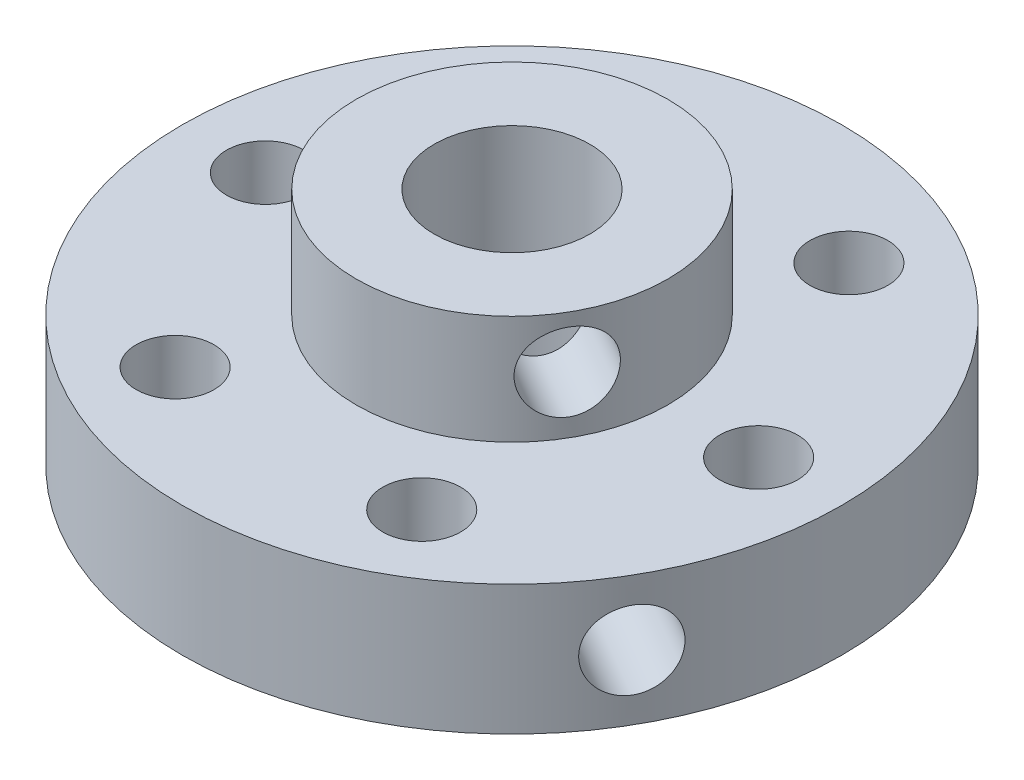
ISO-10303-21;
HEADER;
FILE_DESCRIPTION(('STEP AP214'),'2;1');
FILE_NAME('part.step','',(''),(''),'','','');
FILE_SCHEMA(('AUTOMOTIVE_DESIGN { 1 0 10303 214 1 1 1 1 }'));
ENDSEC;
DATA;
#1=APPLICATION_CONTEXT('core data for automotive mechanical design processes');
#2=APPLICATION_PROTOCOL_DEFINITION('international standard','automotive_design',2000,#1);
#3=PRODUCT_CONTEXT('',#1,'mechanical');
#4=PRODUCT('Part','Part','',(#3));
#5=PRODUCT_RELATED_PRODUCT_CATEGORY('part','',(#4));
#6=PRODUCT_DEFINITION_FORMATION('','',#4);
#7=PRODUCT_DEFINITION_CONTEXT('part definition',#1,'design');
#8=PRODUCT_DEFINITION('design','',#6,#7);
#9=PRODUCT_DEFINITION_SHAPE('','',#8);
#10=(LENGTH_UNIT() NAMED_UNIT(*) SI_UNIT(.MILLI.,.METRE.));
#11=(NAMED_UNIT(*) PLANE_ANGLE_UNIT() SI_UNIT($,.RADIAN.));
#12=(NAMED_UNIT(*) SI_UNIT($,.STERADIAN.) SOLID_ANGLE_UNIT());
#13=UNCERTAINTY_MEASURE_WITH_UNIT(LENGTH_MEASURE(1.E-05),#10,'distance_accuracy_value','');
#14=(GEOMETRIC_REPRESENTATION_CONTEXT(3) GLOBAL_UNCERTAINTY_ASSIGNED_CONTEXT((#13)) GLOBAL_UNIT_ASSIGNED_CONTEXT((#10,
#11,#12)) REPRESENTATION_CONTEXT('',''));
#15=CARTESIAN_POINT('',(0.,0.,0.));
#16=DIRECTION('',(0.,0.,1.));
#17=DIRECTION('',(1.,0.,0.));
#18=AXIS2_PLACEMENT_3D('',#15,#16,#17);
#19=CARTESIAN_POINT('',(0.,5.,0.));
#20=DIRECTION('',(0.,1.,0.));
#21=DIRECTION('',(0.,0.,1.));
#22=AXIS2_PLACEMENT_3D('',#19,#20,#21);
#23=PLANE('',#22);
#24=CARTESIAN_POINT('',(-4.7500000000001,5.,8.22724133595211));
#25=DIRECTION('',(0.,1.,0.));
#26=DIRECTION('',(0.,0.,1.));
#27=AXIS2_PLACEMENT_3D('',#24,#25,#26);
#28=CIRCLE('',#27,1.5);
#29=CARTESIAN_POINT('',(-4.7500000000001,5.,9.72724133595211));
#30=VERTEX_POINT('',#29);
#31=EDGE_CURVE('E77',#30,#30,#28,.T.);
#32=ORIENTED_EDGE('',*,*,#31,.F.);
#33=EDGE_LOOP('',(#32));
#34=FACE_BOUND('',#33,.T.);
#35=CARTESIAN_POINT('',(4.74999999999992,5.,8.22724133595221));
#36=DIRECTION('',(0.,1.,0.));
#37=DIRECTION('',(0.,0.,1.));
#38=AXIS2_PLACEMENT_3D('',#35,#36,#37);
#39=CIRCLE('',#38,1.5);
#40=CARTESIAN_POINT('',(4.74999999999992,5.,9.72724133595221));
#41=VERTEX_POINT('',#40);
#42=EDGE_CURVE('E73',#41,#41,#39,.T.);
#43=ORIENTED_EDGE('',*,*,#42,.F.);
#44=EDGE_LOOP('',(#43));
#45=FACE_BOUND('',#44,.T.);
#46=CARTESIAN_POINT('',(9.5,5.,0.));
#47=DIRECTION('',(0.,1.,0.));
#48=DIRECTION('',(0.,0.,1.));
#49=AXIS2_PLACEMENT_3D('',#46,#47,#48);
#50=CIRCLE('',#49,1.5);
#51=CARTESIAN_POINT('',(9.5,5.,1.50000000000007));
#52=VERTEX_POINT('',#51);
#53=EDGE_CURVE('E69',#52,#52,#50,.T.);
#54=ORIENTED_EDGE('',*,*,#53,.F.);
#55=EDGE_LOOP('',(#54));
#56=FACE_BOUND('',#55,.T.);
#57=CARTESIAN_POINT('',(4.75000000000004,5.,-8.22724133595215));
#58=DIRECTION('',(0.,1.,0.));
#59=DIRECTION('',(0.,0.,1.));
#60=AXIS2_PLACEMENT_3D('',#57,#58,#59);
#61=CIRCLE('',#60,1.5);
#62=CARTESIAN_POINT('',(4.75000000000004,5.,-6.72724133595215));
#63=VERTEX_POINT('',#62);
#64=EDGE_CURVE('E65',#63,#63,#61,.T.);
#65=ORIENTED_EDGE('',*,*,#64,.F.);
#66=EDGE_LOOP('',(#65));
#67=FACE_BOUND('',#66,.T.);
#68=CARTESIAN_POINT('',(-4.74999999999998,5.,-8.22724133595218));
#69=DIRECTION('',(0.,1.,0.));
#70=DIRECTION('',(0.,0.,1.));
#71=AXIS2_PLACEMENT_3D('',#68,#69,#70);
#72=CIRCLE('',#71,1.5);
#73=CARTESIAN_POINT('',(-4.74999999999998,5.,-6.72724133595218));
#74=VERTEX_POINT('',#73);
#75=EDGE_CURVE('E61',#74,#74,#72,.T.);
#76=ORIENTED_EDGE('',*,*,#75,.F.);
#77=EDGE_LOOP('',(#76));
#78=FACE_BOUND('',#77,.T.);
#79=CARTESIAN_POINT('',(-9.5,5.,0.));
#80=DIRECTION('',(0.,1.,0.));
#81=DIRECTION('',(0.,0.,1.));
#82=AXIS2_PLACEMENT_3D('',#79,#80,#81);
#83=CIRCLE('',#82,1.5);
#84=CARTESIAN_POINT('',(-9.5,5.,1.5));
#85=VERTEX_POINT('',#84);
#86=EDGE_CURVE('E60',#85,#85,#83,.T.);
#87=ORIENTED_EDGE('',*,*,#86,.F.);
#88=EDGE_LOOP('',(#87));
#89=FACE_BOUND('',#88,.T.);
#90=CARTESIAN_POINT('',(0.,5.,0.));
#91=DIRECTION('',(0.,1.,0.));
#92=DIRECTION('',(0.,0.,1.));
#93=AXIS2_PLACEMENT_3D('',#90,#91,#92);
#94=CIRCLE('',#93,12.7);
#95=CARTESIAN_POINT('',(0.,5.,12.7));
#96=VERTEX_POINT('',#95);
#97=EDGE_CURVE('E10',#96,#96,#94,.T.);
#98=ORIENTED_EDGE('',*,*,#97,.T.);
#99=EDGE_LOOP('',(#98));
#100=FACE_BOUND('',#99,.T.);
#101=CARTESIAN_POINT('',(0.,5.,0.));
#102=DIRECTION('',(0.,1.,0.));
#103=DIRECTION('',(0.,0.,1.));
#104=AXIS2_PLACEMENT_3D('',#101,#102,#103);
#105=CIRCLE('',#104,6.);
#106=CARTESIAN_POINT('',(0.,5.,6.));
#107=VERTEX_POINT('',#106);
#108=EDGE_CURVE('E54',#107,#107,#105,.T.);
#109=ORIENTED_EDGE('',*,*,#108,.F.);
#110=EDGE_LOOP('',(#109));
#111=FACE_BOUND('',#110,.T.);
#112=ADVANCED_FACE('F33',(#34,#45,#56,#67,#78,#89,#100,#111),#23,.T.);
#113=CARTESIAN_POINT('',(0.,5.,0.));
#114=DIRECTION('',(0.,-1.,0.));
#115=DIRECTION('',(0.,0.,-1.));
#116=AXIS2_PLACEMENT_3D('',#113,#114,#115);
#117=CYLINDRICAL_SURFACE('',#116,12.7);
#118=CARTESIAN_POINT('',(11.6715383531808,2.5,5.00651500249722));
#119=CARTESIAN_POINT('',(11.6715375511328,2.41606022007603,5.0065186850722));
#120=CARTESIAN_POINT('',(11.6687371402096,2.33206707141792,5.01306104844977));
#121=CARTESIAN_POINT('',(11.6575487227989,2.16641569284176,5.03902271017339));
#122=CARTESIAN_POINT('',(11.6491547825431,2.08476003864453,5.05845568312929));
#123=CARTESIAN_POINT('',(11.6268491033756,1.92620614824594,5.10951575215548));
#124=CARTESIAN_POINT('',(11.6129409901787,1.84930482427662,5.14113483515477));
#125=CARTESIAN_POINT('',(11.5797351416414,1.70237121936865,5.21549462853855));
#126=CARTESIAN_POINT('',(11.5604383718177,1.63233771091851,5.2582333464604));
#127=CARTESIAN_POINT('',(11.5165602597939,1.50076168387389,5.35365310882416));
#128=CARTESIAN_POINT('',(11.4919556690369,1.43925854089039,5.40637776410837));
#129=CARTESIAN_POINT('',(11.4378314457157,1.32682892417707,5.51996027188924));
#130=CARTESIAN_POINT('',(11.4083115747294,1.2759029637766,5.58081851888802));
#131=CARTESIAN_POINT('',(11.3447314286383,1.18593337302553,5.7089571247974));
#132=CARTESIAN_POINT('',(11.3106580376303,1.14692517904565,5.776255869613));
#133=CARTESIAN_POINT('',(11.23869753301,1.0821253045689,5.91504702402329));
#134=CARTESIAN_POINT('',(11.2008105464809,1.05633318383801,5.98653929384114));
#135=CARTESIAN_POINT('',(11.1222746857511,1.01881469808402,6.13121074051527));
#136=CARTESIAN_POINT('',(11.0816395710108,1.00702305244594,6.20438045376266));
#137=CARTESIAN_POINT('',(10.998512641152,0.997638020019918,6.35057387860671));
#138=CARTESIAN_POINT('',(10.9560208917337,1.00004413122345,6.42359759527423));
#139=CARTESIAN_POINT('',(10.870634808896,1.01893379601258,6.56705677899792));
#140=CARTESIAN_POINT('',(10.8277435363973,1.03534714601565,6.6375033295666));
#141=CARTESIAN_POINT('',(10.742699868983,1.08167574223186,6.77428146203633));
#142=CARTESIAN_POINT('',(10.7005474868392,1.11159122159295,6.84061297285846));
#143=CARTESIAN_POINT('',(10.618299567646,1.18415022962009,6.96760053693703));
#144=CARTESIAN_POINT('',(10.5782092474188,1.22682434264288,7.02824248729147));
#145=CARTESIAN_POINT('',(10.5016227204509,1.3236670220063,7.1421733220564));
#146=CARTESIAN_POINT('',(10.4651266610014,1.3778360591171,7.19546190516502));
#147=CARTESIAN_POINT('',(10.3968869927955,1.49652461569217,7.29371980185864));
#148=CARTESIAN_POINT('',(10.365173747301,1.56110528597974,7.33863635863888));
#149=CARTESIAN_POINT('',(10.3080277339784,1.69857325819117,7.4186920079933));
#150=CARTESIAN_POINT('',(10.2825949822286,1.77146058137982,7.45383107553661));
#151=CARTESIAN_POINT('',(10.2390580508462,1.92352487103104,7.51352529742341));
#152=CARTESIAN_POINT('',(10.2209564664634,2.00270405298137,7.5380767039098));
#153=CARTESIAN_POINT('',(10.1928781268933,2.16507778504808,7.57600140912822));
#154=CARTESIAN_POINT('',(10.1829010234175,2.24827216287493,7.58937518703497));
#155=CARTESIAN_POINT('',(10.1715480396365,2.415778062783,7.60458424832536));
#156=CARTESIAN_POINT('',(10.1701207007547,2.50007983446653,7.60648856349156));
#157=CARTESIAN_POINT('',(10.1757929703964,2.6678780433266,7.59889853780723));
#158=CARTESIAN_POINT('',(10.1828924170989,2.75137449575614,7.58940441327586));
#159=CARTESIAN_POINT('',(10.2052705811091,2.91493773669146,7.55928561547891));
#160=CARTESIAN_POINT('',(10.2205248015315,2.99501402536882,7.53869427667575));
#161=CARTESIAN_POINT('',(10.2585424280401,3.14976050360252,7.48687744007665));
#162=CARTESIAN_POINT('',(10.2813060710194,3.2244305225214,7.45565160680267));
#163=CARTESIAN_POINT('',(10.3335236416589,3.36663259994591,7.38310831074652));
#164=CARTESIAN_POINT('',(10.3630086781427,3.43412925794285,7.34174385391931));
#165=CARTESIAN_POINT('',(10.4274284480773,3.55970808983753,7.24995666743039));
#166=CARTESIAN_POINT('',(10.4623633703968,3.61778993731794,7.19953362382958));
#167=CARTESIAN_POINT('',(10.5365361163634,3.72318917396867,7.0905405667121));
#168=CARTESIAN_POINT('',(10.5757948583392,3.77045049257152,7.03193054298297));
#169=CARTESIAN_POINT('',(10.6570237365906,3.85247976246808,6.90820627547804));
#170=CARTESIAN_POINT('',(10.6989938232688,3.88724794221714,6.84309215066709));
#171=CARTESIAN_POINT('',(10.784075510516,3.9432106803739,6.70820786311629));
#172=CARTESIAN_POINT('',(10.8271840834794,3.9644380761281,6.63844942083571));
#173=CARTESIAN_POINT('',(10.9132291756426,3.99282361152357,6.49602549532545));
#174=CARTESIAN_POINT('',(10.9561657016596,3.99998231423368,6.42336012855788));
#175=CARTESIAN_POINT('',(11.0403113313993,4.00001751368946,6.27762402175686));
#176=CARTESIAN_POINT('',(11.0815293555714,3.99298063969374,6.20455843784483));
#177=CARTESIAN_POINT('',(11.1614017298833,3.96500737290691,6.05969925383828));
#178=CARTESIAN_POINT('',(11.2000560805332,3.94407098288102,5.9879056534907));
#179=CARTESIAN_POINT('',(11.2738748561457,3.88891927496915,5.84773662949455));
#180=CARTESIAN_POINT('',(11.3090402452249,3.8547076383819,5.77936026415637));
#181=CARTESIAN_POINT('',(11.3751835780473,3.77398556803596,5.64806243472268));
#182=CARTESIAN_POINT('',(11.4061614937783,3.72747505200944,5.58514100711928));
#183=CARTESIAN_POINT('',(11.4635773185857,3.62315345534259,5.46633160477655));
#184=CARTESIAN_POINT('',(11.489987605967,3.56527785258845,5.4104869330501));
#185=CARTESIAN_POINT('',(11.5376823041713,3.44000171739053,5.30802128938899));
#186=CARTESIAN_POINT('',(11.5589654952199,3.37259892439749,5.26140251283327));
#187=CARTESIAN_POINT('',(11.5962187015426,3.22991717495939,5.17878162753473));
#188=CARTESIAN_POINT('',(11.6121700913129,3.1546117913843,5.14281678476389));
#189=CARTESIAN_POINT('',(11.6384914873378,2.99849487376943,5.08297101821705));
#190=CARTESIAN_POINT('',(11.6488676318486,2.91768950605936,5.05907680661026));
#191=CARTESIAN_POINT('',(11.6614547174806,2.7803781096023,5.02997275348386));
#192=CARTESIAN_POINT('',(11.6652341186577,2.72474194804356,5.02119051680439));
#193=CARTESIAN_POINT('',(11.6702761977197,2.61274521482581,5.00946042340066));
#194=CARTESIAN_POINT('',(11.6715388919384,2.55638464787067,5.0065125288108));
#195=CARTESIAN_POINT('',(11.6715383531808,2.5,5.00651500249722));
#196=B_SPLINE_CURVE_WITH_KNOTS('',3,(#118,#119,#120,#121,#122,#123,#124,#125,#126,#127,#128,
#129,#130,#131,#132,#133,#134,#135,#136,#137,#138,#139,#140,#141,#142,#143,#144,#145,#146,#147,
#148,#149,#150,#151,#152,#153,#154,#155,#156,#157,#158,#159,#160,#161,#162,#163,#164,#165,#166,
#167,#168,#169,#170,#171,#172,#173,#174,#175,#176,#177,#178,#179,#180,#181,#182,#183,#184,#185,
#186,#187,#188,#189,#190,#191,#192,#193,#194,#195),.UNSPECIFIED.,.T.,.F.,(4,2,2,2,2,2,2,2,2,2,2,
2,2,2,2,2,2,2,2,2,2,2,2,2,2,2,2,2,2,2,2,2,2,2,2,2,2,2,4),(0.,0.251613380748291,
0.503494105646092,0.75520948623113,1.00687979442843,1.25967566386849,1.51248379907322,
1.76603647969037,2.0195807137912,2.27193803464322,2.52428643262321,2.77537745114223,
3.02647280554001,3.27817496610754,3.5298874370301,3.78313609467784,4.0363854006491,
4.28972427925203,4.54305229689169,4.79485406155235,5.04665104760417,5.29769585292151,
5.54874857848584,5.80098773913409,6.05323564320078,6.3067624835944,6.56028468764223,
6.8131897215963,7.06608463337016,7.31744090938854,7.568797135401,7.82008370870756,
8.07137196292548,8.32413038231695,8.57694887555923,8.83064152451594,9.08405428658975,
9.25307097883103,9.42208657412913),.UNSPECIFIED.);
#197=CARTESIAN_POINT('',(11.6715383531808,2.5,5.00651500249722));
#198=VERTEX_POINT('',#197);
#199=EDGE_CURVE('E80',#198,#198,#196,.T.);
#200=ORIENTED_EDGE('',*,*,#199,.T.);
#201=EDGE_LOOP('',(#200));
#202=FACE_BOUND('',#201,.T.);
#203=ORIENTED_EDGE('',*,*,#97,.F.);
#204=EDGE_LOOP('',(#203));
#205=FACE_BOUND('',#204,.T.);
#206=CARTESIAN_POINT('',(0.,0.,0.));
#207=DIRECTION('',(0.,1.,0.));
#208=DIRECTION('',(0.,0.,1.));
#209=AXIS2_PLACEMENT_3D('',#206,#207,#208);
#210=CIRCLE('',#209,12.7);
#211=CARTESIAN_POINT('',(0.,0.,12.7));
#212=VERTEX_POINT('',#211);
#213=EDGE_CURVE('E46',#212,#212,#210,.T.);
#214=ORIENTED_EDGE('',*,*,#213,.T.);
#215=EDGE_LOOP('',(#214));
#216=FACE_BOUND('',#215,.T.);
#217=ADVANCED_FACE('F35',(#202,#205,#216),#117,.T.);
#218=CARTESIAN_POINT('',(0.,0.,0.));
#219=DIRECTION('',(0.,1.,0.));
#220=DIRECTION('',(0.,0.,1.));
#221=AXIS2_PLACEMENT_3D('',#218,#219,#220);
#222=PLANE('',#221);
#223=CARTESIAN_POINT('',(-4.7500000000001,0.,8.22724133595211));
#224=DIRECTION('',(0.,1.,0.));
#225=DIRECTION('',(0.,0.,1.));
#226=AXIS2_PLACEMENT_3D('',#223,#224,#225);
#227=CIRCLE('',#226,1.5);
#228=CARTESIAN_POINT('',(-4.7500000000001,0.,9.72724133595211));
#229=VERTEX_POINT('',#228);
#230=EDGE_CURVE('E78',#229,#229,#227,.T.);
#231=ORIENTED_EDGE('',*,*,#230,.T.);
#232=EDGE_LOOP('',(#231));
#233=FACE_BOUND('',#232,.T.);
#234=CARTESIAN_POINT('',(4.74999999999992,0.,8.22724133595221));
#235=DIRECTION('',(0.,1.,0.));
#236=DIRECTION('',(0.,0.,1.));
#237=AXIS2_PLACEMENT_3D('',#234,#235,#236);
#238=CIRCLE('',#237,1.5);
#239=CARTESIAN_POINT('',(4.74999999999992,0.,9.72724133595221));
#240=VERTEX_POINT('',#239);
#241=EDGE_CURVE('E74',#240,#240,#238,.T.);
#242=ORIENTED_EDGE('',*,*,#241,.T.);
#243=EDGE_LOOP('',(#242));
#244=FACE_BOUND('',#243,.T.);
#245=CARTESIAN_POINT('',(9.5,0.,0.));
#246=DIRECTION('',(0.,1.,0.));
#247=DIRECTION('',(0.,0.,1.));
#248=AXIS2_PLACEMENT_3D('',#245,#246,#247);
#249=CIRCLE('',#248,1.5);
#250=CARTESIAN_POINT('',(9.5,0.,1.50000000000007));
#251=VERTEX_POINT('',#250);
#252=EDGE_CURVE('E70',#251,#251,#249,.T.);
#253=ORIENTED_EDGE('',*,*,#252,.T.);
#254=EDGE_LOOP('',(#253));
#255=FACE_BOUND('',#254,.T.);
#256=CARTESIAN_POINT('',(4.75000000000004,0.,-8.22724133595215));
#257=DIRECTION('',(0.,1.,0.));
#258=DIRECTION('',(0.,0.,1.));
#259=AXIS2_PLACEMENT_3D('',#256,#257,#258);
#260=CIRCLE('',#259,1.5);
#261=CARTESIAN_POINT('',(4.75000000000004,0.,-6.72724133595215));
#262=VERTEX_POINT('',#261);
#263=EDGE_CURVE('E66',#262,#262,#260,.T.);
#264=ORIENTED_EDGE('',*,*,#263,.T.);
#265=EDGE_LOOP('',(#264));
#266=FACE_BOUND('',#265,.T.);
#267=CARTESIAN_POINT('',(-4.74999999999998,0.,-8.22724133595218));
#268=DIRECTION('',(0.,1.,0.));
#269=DIRECTION('',(0.,0.,1.));
#270=AXIS2_PLACEMENT_3D('',#267,#268,#269);
#271=CIRCLE('',#270,1.5);
#272=CARTESIAN_POINT('',(-4.74999999999998,0.,-6.72724133595218));
#273=VERTEX_POINT('',#272);
#274=EDGE_CURVE('E62',#273,#273,#271,.T.);
#275=ORIENTED_EDGE('',*,*,#274,.T.);
#276=EDGE_LOOP('',(#275));
#277=FACE_BOUND('',#276,.T.);
#278=CARTESIAN_POINT('',(-9.5,0.,0.));
#279=DIRECTION('',(0.,1.,0.));
#280=DIRECTION('',(0.,0.,1.));
#281=AXIS2_PLACEMENT_3D('',#278,#279,#280);
#282=CIRCLE('',#281,1.5);
#283=CARTESIAN_POINT('',(-9.5,0.,1.5));
#284=VERTEX_POINT('',#283);
#285=EDGE_CURVE('E57',#284,#284,#282,.T.);
#286=ORIENTED_EDGE('',*,*,#285,.T.);
#287=EDGE_LOOP('',(#286));
#288=FACE_BOUND('',#287,.T.);
#289=CARTESIAN_POINT('',(0.,0.,0.));
#290=DIRECTION('',(0.,1.,0.));
#291=DIRECTION('',(0.,0.,1.));
#292=AXIS2_PLACEMENT_3D('',#289,#290,#291);
#293=CIRCLE('',#292,3.);
#294=CARTESIAN_POINT('',(0.,0.,3.));
#295=VERTEX_POINT('',#294);
#296=EDGE_CURVE('E125',#295,#295,#293,.T.);
#297=ORIENTED_EDGE('',*,*,#296,.T.);
#298=EDGE_LOOP('',(#297));
#299=FACE_BOUND('',#298,.T.);
#300=ORIENTED_EDGE('',*,*,#213,.F.);
#301=EDGE_LOOP('',(#300));
#302=FACE_BOUND('',#301,.T.);
#303=ADVANCED_FACE('F141',(#233,#244,#255,#266,#277,#288,#299,#302),#222,.F.);
#304=CARTESIAN_POINT('',(0.,9.2,0.));
#305=DIRECTION('',(0.,-1.,0.));
#306=DIRECTION('',(0.,0.,-1.));
#307=AXIS2_PLACEMENT_3D('',#304,#305,#306);
#308=CYLINDRICAL_SURFACE('',#307,6.);
#309=CARTESIAN_POINT('',(5.78115294937452,7.2,1.60569940397895));
#310=CARTESIAN_POINT('',(5.78115314231204,7.11716954944523,1.6057022322028));
#311=CARTESIAN_POINT('',(5.77926171584209,7.0343130607932,1.6125567500908));
#312=CARTESIAN_POINT('',(5.77162561713858,6.87097945309558,1.63967353276891));
#313=CARTESIAN_POINT('',(5.76587870231826,6.790503747319,1.65994360076726));
#314=CARTESIAN_POINT('',(5.75034604035946,6.63431787708778,1.71297319214652));
#315=CARTESIAN_POINT('',(5.74056550597316,6.5586017067686,1.74571659176208));
#316=CARTESIAN_POINT('',(5.7166878648689,6.41381348847605,1.82238447138034));
#317=CARTESIAN_POINT('',(5.70259057488481,6.34474172275186,1.86630942607815));
#318=CARTESIAN_POINT('',(5.66944577568131,6.21368301284268,1.96472046203058));
#319=CARTESIAN_POINT('',(5.65030559429271,6.15186383978997,2.01939880387075));
#320=CARTESIAN_POINT('',(5.60694261692958,6.0385431633838,2.13684501853835));
#321=CARTESIAN_POINT('',(5.58271934621553,5.98704262462695,2.19961364675369));
#322=CARTESIAN_POINT('',(5.52869561458064,5.89513471942123,2.33210328221008));
#323=CARTESIAN_POINT('',(5.49882204924164,5.85489216710312,2.40190907774058));
#324=CARTESIAN_POINT('',(5.43388533273655,5.78771421350815,2.5454042643088));
#325=CARTESIAN_POINT('',(5.39882294825177,5.76077684885069,2.61909308057128));
#326=CARTESIAN_POINT('',(5.32480824085292,5.72151129925285,2.76641869245945));
#327=CARTESIAN_POINT('',(5.28594911057378,5.70889821340405,2.84002630039448));
#328=CARTESIAN_POINT('',(5.20468739773283,5.69774497243467,2.98634011890088));
#329=CARTESIAN_POINT('',(5.1622853399787,5.69920273667424,3.05904646114937));
#330=CARTESIAN_POINT('',(5.07619887781652,5.71594491015009,3.19982277374007));
#331=CARTESIAN_POINT('',(5.03256380576343,5.73092179503231,3.26795982417603));
#332=CARTESIAN_POINT('',(4.94461266506464,5.7737827620291,3.39956967865773));
#333=CARTESIAN_POINT('',(4.90029656028919,5.80166753122645,3.4630422342054));
#334=CARTESIAN_POINT('',(4.81221827235016,5.86980154241224,3.58444357158893));
#335=CARTESIAN_POINT('',(4.76846471209192,5.91016022679705,3.64231708089813));
#336=CARTESIAN_POINT('',(4.68365710698843,6.00201340746975,3.75074677118076));
#337=CARTESIAN_POINT('',(4.64260353342016,6.05350984113637,3.80130167654735));
#338=CARTESIAN_POINT('',(4.56387721739154,6.16782524518942,3.89549734520602));
#339=CARTESIAN_POINT('',(4.52632604764425,6.23091293540866,3.93891394816872));
#340=CARTESIAN_POINT('',(4.45770257108284,6.36575998412415,4.01641318405456));
#341=CARTESIAN_POINT('',(4.42663056709668,6.4375197476946,4.05049538072274));
#342=CARTESIAN_POINT('',(4.37246979139935,6.58817402048938,4.10890612871599));
#343=CARTESIAN_POINT('',(4.34942046015504,6.66710143818792,4.1331865842405));
#344=CARTESIAN_POINT('',(4.31287010679881,6.82955128084587,4.17131353025891));
#345=CARTESIAN_POINT('',(4.29936704143726,6.91307271838988,4.18516225356618));
#346=CARTESIAN_POINT('',(4.28297313772414,7.07997570091387,4.20193719047877));
#347=CARTESIAN_POINT('',(4.27981142725044,7.16330267599778,4.20514223031212));
#348=CARTESIAN_POINT('',(4.28353314379274,7.3294931619469,4.20135108081817));
#349=CARTESIAN_POINT('',(4.29041564611782,7.41235671477075,4.19435583055065));
#350=CARTESIAN_POINT('',(4.31360643262285,7.57386855897282,4.17049947829599));
#351=CARTESIAN_POINT('',(4.32975865408186,7.65256363594251,4.15380166943166));
#352=CARTESIAN_POINT('',(4.37045307600682,7.80505887471101,4.11096183951203));
#353=CARTESIAN_POINT('',(4.39499627032897,7.8788584554332,4.08481869969785));
#354=CARTESIAN_POINT('',(4.45174656628934,8.02106476672041,4.0229024098857));
#355=CARTESIAN_POINT('',(4.48409456727113,8.08933730402586,3.9869504068225));
#356=CARTESIAN_POINT('',(4.55459176282196,8.21711301768081,3.90622065591824));
#357=CARTESIAN_POINT('',(4.59274191057023,8.27661474999005,3.86144145758304));
#358=CARTESIAN_POINT('',(4.67412728913651,8.38668662554258,3.76254289055064));
#359=CARTESIAN_POINT('',(4.71746587066945,8.43699603752929,3.70821785377038));
#360=CARTESIAN_POINT('',(4.80650749606963,8.52536152017075,3.59205140921153));
#361=CARTESIAN_POINT('',(4.85221041646114,8.56341822996493,3.53021039372187));
#362=CARTESIAN_POINT('',(4.94374003096141,8.62586762071676,3.40083247582247));
#363=CARTESIAN_POINT('',(4.98956335276391,8.65035857062744,3.33334072569811));
#364=CARTESIAN_POINT('',(5.07989599325677,8.68527620076505,3.19398556326316));
#365=CARTESIAN_POINT('',(5.12440556391293,8.69570559524343,3.12212299743506));
#366=CARTESIAN_POINT('',(5.20940894118004,8.7020513843633,2.97806411873691));
#367=CARTESIAN_POINT('',(5.2499787879048,8.69835256364309,2.90592936709026));
#368=CARTESIAN_POINT('',(5.32731829744491,8.6774282590585,2.7615909344568));
#369=CARTESIAN_POINT('',(5.36408807324184,8.66020317748035,2.68938725558375));
#370=CARTESIAN_POINT('',(5.43290493318282,8.61292167034361,2.54749560865466));
#371=CARTESIAN_POINT('',(5.46497637576921,8.58293482002806,2.4777961900841));
#372=CARTESIAN_POINT('',(5.52427552422513,8.51104413147101,2.34261278443442));
#373=CARTESIAN_POINT('',(5.55150261879823,8.46913879099565,2.27712933002188));
#374=CARTESIAN_POINT('',(5.60164517796944,8.37342714900439,2.15088343622373));
#375=CARTESIAN_POINT('',(5.62444172128728,8.31935978563893,2.09027168288864));
#376=CARTESIAN_POINT('',(5.66505954815106,8.2013657220393,1.97754850629645));
#377=CARTESIAN_POINT('',(5.6828795689608,8.13743652585314,1.92543924184147));
#378=CARTESIAN_POINT('',(5.71411839684785,8.000097878698,1.83068089201198));
#379=CARTESIAN_POINT('',(5.72744889301925,7.92653381488106,1.78822643143309));
#380=CARTESIAN_POINT('',(5.74957344100167,7.77291676511595,1.71576534485498));
#381=CARTESIAN_POINT('',(5.75837079427053,7.69286855083989,1.68574966290379));
#382=CARTESIAN_POINT('',(5.77046002265378,7.54413448225993,1.64382731991211));
#383=CARTESIAN_POINT('',(5.77447814933312,7.47616025342421,1.62957034817516));
#384=CARTESIAN_POINT('',(5.77982441712736,7.33879669650005,1.61050560827542));
#385=CARTESIAN_POINT('',(5.78115278770318,7.26940748963241,1.60569703407856));
#386=CARTESIAN_POINT('',(5.78115294937452,7.2,1.60569940397895));
#387=B_SPLINE_CURVE_WITH_KNOTS('',3,(#309,#310,#311,#312,#313,#314,#315,#316,#317,#318,#319,
#320,#321,#322,#323,#324,#325,#326,#327,#328,#329,#330,#331,#332,#333,#334,#335,#336,#337,#338,
#339,#340,#341,#342,#343,#344,#345,#346,#347,#348,#349,#350,#351,#352,#353,#354,#355,#356,#357,
#358,#359,#360,#361,#362,#363,#364,#365,#366,#367,#368,#369,#370,#371,#372,#373,#374,#375,#376,
#377,#378,#379,#380,#381,#382,#383,#384,#385,#386),.UNSPECIFIED.,.T.,.F.,(4,2,2,2,2,2,2,2,2,2,2,
2,2,2,2,2,2,2,2,2,2,2,2,2,2,2,2,2,2,2,2,2,2,2,2,2,2,2,4),(0.,0.248236465041681,0.4966174448572,
0.744678436299613,0.992749960532871,1.24574372515786,1.4987611288792,1.75530897838752,
2.01181895908255,2.26313250597208,2.51440889199612,2.76010957613368,3.00582334034872,
3.25375724552667,3.50173431281348,3.75642279943147,4.01112318719881,4.26705859205042,
4.52293920077729,4.7720614485703,5.02116076310281,5.26618443005524,5.51123712852851,
5.76109707515495,6.01099811331027,6.26715198579191,6.52329249431732,6.77755243684158,
7.03176329345423,7.27910067676474,7.52643070426189,7.77242925935827,8.01845883442843,
8.27038257949242,8.52237018939305,8.77905886370807,9.03556032819972,9.24358696306398,
9.45159585059713),.UNSPECIFIED.);
#388=CARTESIAN_POINT('',(5.78115294937452,7.2,1.60569940397895));
#389=VERTEX_POINT('',#388);
#390=EDGE_CURVE('E86',#389,#389,#387,.T.);
#391=ORIENTED_EDGE('',*,*,#390,.T.);
#392=EDGE_LOOP('',(#391));
#393=FACE_BOUND('',#392,.T.);
#394=CARTESIAN_POINT('',(0.,9.2,0.));
#395=DIRECTION('',(0.,1.,0.));
#396=DIRECTION('',(0.,0.,1.));
#397=AXIS2_PLACEMENT_3D('',#394,#395,#396);
#398=CIRCLE('',#397,6.);
#399=CARTESIAN_POINT('',(0.,9.2,6.));
#400=VERTEX_POINT('',#399);
#401=EDGE_CURVE('E51',#400,#400,#398,.T.);
#402=ORIENTED_EDGE('',*,*,#401,.F.);
#403=EDGE_LOOP('',(#402));
#404=FACE_BOUND('',#403,.T.);
#405=ORIENTED_EDGE('',*,*,#108,.T.);
#406=EDGE_LOOP('',(#405));
#407=FACE_BOUND('',#406,.T.);
#408=ADVANCED_FACE('F133',(#393,#404,#407),#308,.T.);
#409=CARTESIAN_POINT('',(0.,9.2,0.));
#410=DIRECTION('',(0.,1.,0.));
#411=DIRECTION('',(0.,0.,1.));
#412=AXIS2_PLACEMENT_3D('',#409,#410,#411);
#413=PLANE('',#412);
#414=CARTESIAN_POINT('',(0.,9.2,0.));
#415=DIRECTION('',(0.,1.,0.));
#416=DIRECTION('',(0.,0.,1.));
#417=AXIS2_PLACEMENT_3D('',#414,#415,#416);
#418=CIRCLE('',#417,3.);
#419=CARTESIAN_POINT('',(0.,9.2,3.));
#420=VERTEX_POINT('',#419);
#421=EDGE_CURVE('E122',#420,#420,#418,.T.);
#422=ORIENTED_EDGE('',*,*,#421,.F.);
#423=EDGE_LOOP('',(#422));
#424=FACE_BOUND('',#423,.T.);
#425=ORIENTED_EDGE('',*,*,#401,.T.);
#426=EDGE_LOOP('',(#425));
#427=FACE_BOUND('',#426,.T.);
#428=ADVANCED_FACE('F151',(#424,#427),#413,.T.);
#429=CARTESIAN_POINT('',(0.,-5.,0.));
#430=DIRECTION('',(0.,1.,0.));
#431=DIRECTION('',(0.,0.,1.));
#432=AXIS2_PLACEMENT_3D('',#429,#430,#431);
#433=CYLINDRICAL_SURFACE('',#432,3.);
#434=CARTESIAN_POINT('',(3.,7.2,0.));
#435=CARTESIAN_POINT('',(3.0000031695696,7.27816171229288,8.12929158024415E-06));
#436=CARTESIAN_POINT('',(3.00002604741293,7.35642211728757,0.00711649748348005));
#437=CARTESIAN_POINT('',(2.99982598959527,7.51054089701573,0.0350199657169947));
#438=CARTESIAN_POINT('',(2.99960253674331,7.58639387256511,0.0558438255148989));
#439=CARTESIAN_POINT('',(2.9981163254635,7.73317749651591,0.109590595457491));
#440=CARTESIAN_POINT('',(2.99685905032792,7.80413197871038,0.142449165907019));
#441=CARTESIAN_POINT('',(2.99227346647896,7.94013630299508,0.218510270423945));
#442=CARTESIAN_POINT('',(2.98894504571132,8.00518582539368,0.261713364078676));
#443=CARTESIAN_POINT('',(2.9786893477063,8.13345859283626,0.360664781531744));
#444=CARTESIAN_POINT('',(2.97148788610125,8.19608870351031,0.417153916335821));
#445=CARTESIAN_POINT('',(2.95196419251584,8.31211258261006,0.538207520009719));
#446=CARTESIAN_POINT('',(2.93963941661602,8.36550174387528,0.602775989426433));
#447=CARTESIAN_POINT('',(2.90759355789689,8.46505072672149,0.742544538551104));
#448=CARTESIAN_POINT('',(2.8874299108015,8.5104806517893,0.818167883742909));
#449=CARTESIAN_POINT('',(2.83878891246674,8.58771127986864,0.973596054630293));
#450=CARTESIAN_POINT('',(2.8103168271079,8.61952058420576,1.05339820559561));
#451=CARTESIAN_POINT('',(2.74706668425262,8.66625699195165,1.20835476842183));
#452=CARTESIAN_POINT('',(2.71288147726775,8.6822242895333,1.28343585308651));
#453=CARTESIAN_POINT('',(2.63760269992698,8.70024917801256,1.43176562892764));
#454=CARTESIAN_POINT('',(2.59651332502341,8.70231518519357,1.50501540206754));
#455=CARTESIAN_POINT('',(2.51262286281283,8.69287998904448,1.64089899884251));
#456=CARTESIAN_POINT('',(2.4702813520238,8.68254297671817,1.70390206606965));
#457=CARTESIAN_POINT('',(2.38247170883384,8.65067873414301,1.82466531049677));
#458=CARTESIAN_POINT('',(2.3370033426903,8.62915066653566,1.88242509499391));
#459=CARTESIAN_POINT('',(2.24401349952732,8.57537615086528,1.99240210457787));
#460=CARTESIAN_POINT('',(2.19647232034758,8.5429855302419,2.04453158961525));
#461=CARTESIAN_POINT('',(2.10175286421623,8.46860487569776,2.14178663382468));
#462=CARTESIAN_POINT('',(2.05457472345459,8.42661140504647,2.18690967575438));
#463=CARTESIAN_POINT('',(1.95803039800664,8.32965697270048,2.27392369986505));
#464=CARTESIAN_POINT('',(1.9088789401234,8.27384545751098,2.31510597015328));
#465=CARTESIAN_POINT('',(1.81555389407394,8.15311541260474,2.38899862918875));
#466=CARTESIAN_POINT('',(1.77138414671686,8.08818994158891,2.42170250613321));
#467=CARTESIAN_POINT('',(1.68801223180934,7.94602771136387,2.48060173348301));
#468=CARTESIAN_POINT('',(1.64930364979949,7.86827096541868,2.5062518811597));
#469=CARTESIAN_POINT('',(1.58369497342654,7.7055934929615,2.54822335069104));
#470=CARTESIAN_POINT('',(1.55678256105261,7.62068035047366,2.56455440930169));
#471=CARTESIAN_POINT('',(1.51922194377496,7.45317823307581,2.58696947991922));
#472=CARTESIAN_POINT('',(1.50745387805137,7.37093832143467,2.59376296860315));
#473=CARTESIAN_POINT('',(1.49773003030331,7.20539798772519,2.59939307234126));
#474=CARTESIAN_POINT('',(1.49976449151346,7.12209835632032,2.59823530799031));
#475=CARTESIAN_POINT('',(1.51639723990441,6.96651912213191,2.58855303224588));
#476=CARTESIAN_POINT('',(1.52959681245657,6.89403082333811,2.58084823092942));
#477=CARTESIAN_POINT('',(1.56556007587333,6.75244832059356,2.55919105282622));
#478=CARTESIAN_POINT('',(1.58832686396282,6.68335522388009,2.54523665274085));
#479=CARTESIAN_POINT('',(1.64301786579656,6.54688300364596,2.51029624108666));
#480=CARTESIAN_POINT('',(1.67531737067438,6.47973147471967,2.48901449248114));
#481=CARTESIAN_POINT('',(1.74656210607931,6.35179609269151,2.43954927861361));
#482=CARTESIAN_POINT('',(1.78551074851041,6.29101553473008,2.41136226677404));
#483=CARTESIAN_POINT('',(1.87332421085099,6.16953184871468,2.34394724144728));
#484=CARTESIAN_POINT('',(1.92282012590729,6.10980427392351,2.30377534274124));
#485=CARTESIAN_POINT('',(2.02515702138495,6.00088164300961,2.21435219499318));
#486=CARTESIAN_POINT('',(2.0779991239499,5.95169014465419,2.16509788946642));
#487=CARTESIAN_POINT('',(2.18586297396005,5.86413941107485,2.05621512144628));
#488=CARTESIAN_POINT('',(2.24090544016845,5.82610032268363,1.99634717283161));
#489=CARTESIAN_POINT('',(2.34893841223189,5.76429314421391,1.86801997494321));
#490=CARTESIAN_POINT('',(2.40193068148499,5.74051252295054,1.79956833370064));
#491=CARTESIAN_POINT('',(2.49852225418989,5.70994715373801,1.66245775735807));
#492=CARTESIAN_POINT('',(2.54253726910199,5.70180318618583,1.59439410702367));
#493=CARTESIAN_POINT('',(2.62496799044373,5.6987351018184,1.45468598356343));
#494=CARTESIAN_POINT('',(2.66338565201419,5.70380635721465,1.38304277256816));
#495=CARTESIAN_POINT('',(2.73122963078875,5.72612461019344,1.24339057747399));
#496=CARTESIAN_POINT('',(2.76108161526194,5.74254727388651,1.17545319856169));
#497=CARTESIAN_POINT('',(2.81468490220718,5.78599049895446,1.04058555198283));
#498=CARTESIAN_POINT('',(2.83843532899111,5.81301258014018,0.973655430172804));
#499=CARTESIAN_POINT('',(2.88093544431257,5.87809057824896,0.839851359568225));
#500=CARTESIAN_POINT('',(2.8994278026461,5.91656898481176,0.773102248903147));
#501=CARTESIAN_POINT('',(2.93069249387627,6.00293689628857,0.644535693500349));
#502=CARTESIAN_POINT('',(2.94346219072566,6.05083072367351,0.582720532256005));
#503=CARTESIAN_POINT('',(2.96526322795065,6.16019570853405,0.459871738172635));
#504=CARTESIAN_POINT('',(2.9737960518022,6.22254373121579,0.39952811728181));
#505=CARTESIAN_POINT('',(2.98656620126857,6.35617608169465,0.289007884120446));
#506=CARTESIAN_POINT('',(2.99079973723685,6.42746823130152,0.238840272698104));
#507=CARTESIAN_POINT('',(2.99660601070415,6.57995496987143,0.149714298341631));
#508=CARTESIAN_POINT('',(2.99809043396239,6.6613912966931,0.111160270379052));
#509=CARTESIAN_POINT('',(2.99973703676721,6.82999860650967,0.0502877328236533));
#510=CARTESIAN_POINT('',(2.99990365656108,6.91714933336903,0.0279149334556424));
#511=CARTESIAN_POINT('',(2.99998663149909,7.03770803347799,0.00974891026989693));
#512=CARTESIAN_POINT('',(2.99999475284075,7.07005184159682,0.00610053579436638));
#513=CARTESIAN_POINT('',(3.0000007775355,7.13492472102336,0.00122430719490697));
#514=CARTESIAN_POINT('',(2.99999868020507,7.16745380457881,-3.38500145440034E-06));
#515=CARTESIAN_POINT('',(3.,7.2,0.));
#516=B_SPLINE_CURVE_WITH_KNOTS('',3,(#434,#435,#436,#437,#438,#439,#440,#441,#442,#443,#444,
#445,#446,#447,#448,#449,#450,#451,#452,#453,#454,#455,#456,#457,#458,#459,#460,#461,#462,#463,
#464,#465,#466,#467,#468,#469,#470,#471,#472,#473,#474,#475,#476,#477,#478,#479,#480,#481,#482,
#483,#484,#485,#486,#487,#488,#489,#490,#491,#492,#493,#494,#495,#496,#497,#498,#499,#500,#501,
#502,#503,#504,#505,#506,#507,#508,#509,#510,#511,#512,#513,#514,#515),.UNSPECIFIED.,.T.,.F.,(4,
2,2,2,2,2,2,2,2,2,2,2,2,2,2,2,2,2,2,2,2,2,2,2,2,2,2,2,2,2,2,2,2,2,2,2,2,2,2,2,4),(0.,
0.234348183892073,0.469189339237207,0.702792893878327,0.936409088167724,1.18929346874735,
1.44230356626556,1.71236838358145,1.98226240445837,2.23295227451903,2.4834903552906,
2.71224146226808,2.94100968776183,3.1729430209672,3.40495949025408,3.65890787185336,
3.91305072368878,4.18333262594172,4.45333161317557,4.70193436281318,4.9503613978256,
5.17161275136038,5.39293578654095,5.62450944609132,5.85620229330071,6.1171011537092,
6.37808797467303,6.64596272119449,6.91360169713157,7.1566840558423,7.39968130190957,
7.62666637307239,7.85368400268019,8.09041126079208,8.32724745151079,8.58765362775101,
8.84828914267731,9.11716123557907,9.3851269950414,9.48270202777964,9.58028358741811),.UNSPECIFIED.);
#517=CARTESIAN_POINT('',(3.,7.2,0.));
#518=VERTEX_POINT('',#517);
#519=EDGE_CURVE('E38',#518,#518,#516,.T.);
#520=ORIENTED_EDGE('',*,*,#519,.T.);
#521=EDGE_LOOP('',(#520));
#522=FACE_BOUND('',#521,.T.);
#523=CARTESIAN_POINT('',(3.,2.5,0.));
#524=CARTESIAN_POINT('',(3.0000031695696,2.57816171229288,8.12929158062078E-06));
#525=CARTESIAN_POINT('',(3.00002604741293,2.65642211728757,0.00711649748348039));
#526=CARTESIAN_POINT('',(2.99982598959527,2.81054089701573,0.035019965716995));
#527=CARTESIAN_POINT('',(2.99960253674331,2.88639387256511,0.0558438255148991));
#528=CARTESIAN_POINT('',(2.9981163254635,3.03317749651591,0.109590595457491));
#529=CARTESIAN_POINT('',(2.99685905032792,3.10413197871038,0.142449165907019));
#530=CARTESIAN_POINT('',(2.99227346647896,3.24013630299508,0.218510270423946));
#531=CARTESIAN_POINT('',(2.98894504571132,3.30518582539369,0.261713364078677));
#532=CARTESIAN_POINT('',(2.9786893477063,3.43345859283626,0.360664781531745));
#533=CARTESIAN_POINT('',(2.97148788610125,3.49608870351032,0.417153916335822));
#534=CARTESIAN_POINT('',(2.95196419251584,3.61211258261006,0.53820752000972));
#535=CARTESIAN_POINT('',(2.93963941661602,3.66550174387528,0.602775989426434));
#536=CARTESIAN_POINT('',(2.90759355789689,3.76505072672149,0.742544538551105));
#537=CARTESIAN_POINT('',(2.8874299108015,3.8104806517893,0.818167883742909));
#538=CARTESIAN_POINT('',(2.83878891246674,3.88771127986864,0.973596054630293));
#539=CARTESIAN_POINT('',(2.8103168271079,3.91952058420576,1.05339820559561));
#540=CARTESIAN_POINT('',(2.74706668425262,3.96625699195165,1.20835476842183));
#541=CARTESIAN_POINT('',(2.71288147726775,3.9822242895333,1.28343585308651));
#542=CARTESIAN_POINT('',(2.63760269992698,4.00024917801256,1.43176562892764));
#543=CARTESIAN_POINT('',(2.59651332502341,4.00231518519357,1.50501540206754));
#544=CARTESIAN_POINT('',(2.51262286281283,3.99287998904448,1.64089899884251));
#545=CARTESIAN_POINT('',(2.4702813520238,3.98254297671817,1.70390206606965));
#546=CARTESIAN_POINT('',(2.38247170883383,3.95067873414301,1.82466531049677));
#547=CARTESIAN_POINT('',(2.3370033426903,3.92915066653567,1.88242509499391));
#548=CARTESIAN_POINT('',(2.24401349952732,3.87537615086528,1.99240210457787));
#549=CARTESIAN_POINT('',(2.19647232034758,3.8429855302419,2.04453158961525));
#550=CARTESIAN_POINT('',(2.10175286421623,3.76860487569776,2.14178663382468));
#551=CARTESIAN_POINT('',(2.05457472345459,3.72661140504648,2.18690967575438));
#552=CARTESIAN_POINT('',(1.95803039800664,3.62965697270048,2.27392369986505));
#553=CARTESIAN_POINT('',(1.9088789401234,3.57384545751099,2.31510597015328));
#554=CARTESIAN_POINT('',(1.81555389407394,3.45311541260474,2.38899862918875));
#555=CARTESIAN_POINT('',(1.77138414671686,3.38818994158891,2.42170250613321));
#556=CARTESIAN_POINT('',(1.68801223180934,3.24602771136387,2.48060173348301));
#557=CARTESIAN_POINT('',(1.64930364979949,3.16827096541868,2.50625188115971));
#558=CARTESIAN_POINT('',(1.58369497342654,3.0055934929615,2.54822335069104));
#559=CARTESIAN_POINT('',(1.55678256105261,2.92068035047366,2.56455440930169));
#560=CARTESIAN_POINT('',(1.51922194377496,2.75317823307581,2.58696947991922));
#561=CARTESIAN_POINT('',(1.50745387805137,2.67093832143467,2.59376296860315));
#562=CARTESIAN_POINT('',(1.49773003030331,2.50539798772519,2.59939307234126));
#563=CARTESIAN_POINT('',(1.49976449151346,2.42209835632032,2.59823530799031));
#564=CARTESIAN_POINT('',(1.51639723990441,2.26651912213191,2.58855303224588));
#565=CARTESIAN_POINT('',(1.52959681245657,2.19403082333811,2.58084823092942));
#566=CARTESIAN_POINT('',(1.56556007587333,2.05244832059356,2.55919105282622));
#567=CARTESIAN_POINT('',(1.58832686396282,1.98335522388009,2.54523665274085));
#568=CARTESIAN_POINT('',(1.64301786579656,1.84688300364596,2.51029624108666));
#569=CARTESIAN_POINT('',(1.67531737067438,1.77973147471967,2.48901449248114));
#570=CARTESIAN_POINT('',(1.74656210607931,1.65179609269151,2.43954927861361));
#571=CARTESIAN_POINT('',(1.78551074851041,1.59101553473008,2.41136226677404));
#572=CARTESIAN_POINT('',(1.87332421085099,1.46953184871468,2.34394724144728));
#573=CARTESIAN_POINT('',(1.92282012590729,1.40980427392351,2.30377534274124));
#574=CARTESIAN_POINT('',(2.02515702138495,1.30088164300961,2.21435219499318));
#575=CARTESIAN_POINT('',(2.0779991239499,1.25169014465419,2.16509788946642));
#576=CARTESIAN_POINT('',(2.18586297396005,1.16413941107485,2.05621512144628));
#577=CARTESIAN_POINT('',(2.24090544016845,1.12610032268364,1.99634717283161));
#578=CARTESIAN_POINT('',(2.34893841223189,1.06429314421391,1.86801997494321));
#579=CARTESIAN_POINT('',(2.40193068148499,1.04051252295054,1.79956833370064));
#580=CARTESIAN_POINT('',(2.49852225418989,1.00994715373801,1.66245775735807));
#581=CARTESIAN_POINT('',(2.54253726910199,1.00180318618583,1.59439410702367));
#582=CARTESIAN_POINT('',(2.62496799044373,0.998735101818398,1.45468598356343));
#583=CARTESIAN_POINT('',(2.66338565201419,1.00380635721465,1.38304277256816));
#584=CARTESIAN_POINT('',(2.73122963078875,1.02612461019344,1.24339057747399));
#585=CARTESIAN_POINT('',(2.76108161526194,1.04254727388651,1.17545319856169));
#586=CARTESIAN_POINT('',(2.81468490220718,1.08599049895446,1.04058555198283));
#587=CARTESIAN_POINT('',(2.83843532899111,1.11301258014018,0.973655430172803));
#588=CARTESIAN_POINT('',(2.88093544431257,1.17809057824896,0.839851359568224));
#589=CARTESIAN_POINT('',(2.8994278026461,1.21656898481176,0.773102248903147));
#590=CARTESIAN_POINT('',(2.93069249387627,1.30293689628858,0.644535693500349));
#591=CARTESIAN_POINT('',(2.94346219072566,1.35083072367351,0.582720532256005));
#592=CARTESIAN_POINT('',(2.96526322795065,1.46019570853405,0.459871738172635));
#593=CARTESIAN_POINT('',(2.9737960518022,1.52254373121579,0.39952811728181));
#594=CARTESIAN_POINT('',(2.98656620126857,1.65617608169466,0.289007884120445));
#595=CARTESIAN_POINT('',(2.99079973723685,1.72746823130153,0.238840272698103));
#596=CARTESIAN_POINT('',(2.99660601070415,1.87995496987143,0.149714298341631));
#597=CARTESIAN_POINT('',(2.99809043396239,1.9613912966931,0.111160270379052));
#598=CARTESIAN_POINT('',(2.99973703676721,2.12999860650967,0.0502877328236535));
#599=CARTESIAN_POINT('',(2.99990365656108,2.21714933336903,0.0279149334556426));
#600=CARTESIAN_POINT('',(2.99998663149909,2.33770803347799,0.00974891026989727));
#601=CARTESIAN_POINT('',(2.99999475284075,2.37005184159682,0.00610053579436677));
#602=CARTESIAN_POINT('',(3.0000007775355,2.43492472102337,0.00122430719490743));
#603=CARTESIAN_POINT('',(2.99999868020507,2.46745380457881,-3.38500145394288E-06));
#604=CARTESIAN_POINT('',(3.,2.5,0.));
#605=B_SPLINE_CURVE_WITH_KNOTS('',3,(#523,#524,#525,#526,#527,#528,#529,#530,#531,#532,#533,
#534,#535,#536,#537,#538,#539,#540,#541,#542,#543,#544,#545,#546,#547,#548,#549,#550,#551,#552,
#553,#554,#555,#556,#557,#558,#559,#560,#561,#562,#563,#564,#565,#566,#567,#568,#569,#570,#571,
#572,#573,#574,#575,#576,#577,#578,#579,#580,#581,#582,#583,#584,#585,#586,#587,#588,#589,#590,
#591,#592,#593,#594,#595,#596,#597,#598,#599,#600,#601,#602,#603,#604),.UNSPECIFIED.,.T.,.F.,(4,
2,2,2,2,2,2,2,2,2,2,2,2,2,2,2,2,2,2,2,2,2,2,2,2,2,2,2,2,2,2,2,2,2,2,2,2,2,2,2,4),(0.,
0.234348183892073,0.469189339237207,0.702792893878329,0.936409088167725,1.18929346874735,
1.44230356626556,1.71236838358145,1.98226240445837,2.23295227451903,2.4834903552906,
2.71224146226808,2.94100968776183,3.1729430209672,3.40495949025408,3.65890787185336,
3.91305072368878,4.18333262594173,4.45333161317557,4.70193436281318,4.95036139782559,
5.17161275136038,5.39293578654094,5.62450944609131,5.85620229330071,6.1171011537092,
6.37808797467303,6.64596272119449,6.91360169713157,7.1566840558423,7.39968130190957,
7.62666637307239,7.85368400268019,8.09041126079208,8.32724745151078,8.58765362775101,
8.84828914267731,9.11716123557907,9.3851269950414,9.48270202777964,9.5802835874181),.UNSPECIFIED.);
#606=CARTESIAN_POINT('',(3.,2.5,0.));
#607=VERTEX_POINT('',#606);
#608=EDGE_CURVE('E81',#607,#607,#605,.T.);
#609=ORIENTED_EDGE('',*,*,#608,.T.);
#610=EDGE_LOOP('',(#609));
#611=FACE_BOUND('',#610,.T.);
#612=ORIENTED_EDGE('',*,*,#421,.T.);
#613=EDGE_LOOP('',(#612));
#614=FACE_BOUND('',#613,.T.);
#615=ORIENTED_EDGE('',*,*,#296,.F.);
#616=EDGE_LOOP('',(#615));
#617=FACE_BOUND('',#616,.T.);
#618=ADVANCED_FACE('F87',(#522,#611,#614,#617),#433,.F.);
#619=CARTESIAN_POINT('',(-9.5,-5.,0.));
#620=DIRECTION('',(0.,1.,0.));
#621=DIRECTION('',(0.,0.,1.));
#622=AXIS2_PLACEMENT_3D('',#619,#620,#621);
#623=CYLINDRICAL_SURFACE('',#622,1.5);
#624=ORIENTED_EDGE('',*,*,#86,.T.);
#625=EDGE_LOOP('',(#624));
#626=FACE_BOUND('',#625,.T.);
#627=ORIENTED_EDGE('',*,*,#285,.F.);
#628=EDGE_LOOP('',(#627));
#629=FACE_BOUND('',#628,.T.);
#630=ADVANCED_FACE('F171',(#626,#629),#623,.F.);
#631=CARTESIAN_POINT('',(-4.74999999999998,-5.,-8.22724133595218));
#632=DIRECTION('',(0.,1.,0.));
#633=DIRECTION('',(0.,0.,1.));
#634=AXIS2_PLACEMENT_3D('',#631,#632,#633);
#635=CYLINDRICAL_SURFACE('',#634,1.5);
#636=ORIENTED_EDGE('',*,*,#75,.T.);
#637=EDGE_LOOP('',(#636));
#638=FACE_BOUND('',#637,.T.);
#639=ORIENTED_EDGE('',*,*,#274,.F.);
#640=EDGE_LOOP('',(#639));
#641=FACE_BOUND('',#640,.T.);
#642=ADVANCED_FACE('F177',(#638,#641),#635,.F.);
#643=CARTESIAN_POINT('',(4.75000000000004,-5.,-8.22724133595215));
#644=DIRECTION('',(0.,1.,0.));
#645=DIRECTION('',(0.,0.,1.));
#646=AXIS2_PLACEMENT_3D('',#643,#644,#645);
#647=CYLINDRICAL_SURFACE('',#646,1.5);
#648=ORIENTED_EDGE('',*,*,#64,.T.);
#649=EDGE_LOOP('',(#648));
#650=FACE_BOUND('',#649,.T.);
#651=ORIENTED_EDGE('',*,*,#263,.F.);
#652=EDGE_LOOP('',(#651));
#653=FACE_BOUND('',#652,.T.);
#654=ADVANCED_FACE('F222',(#650,#653),#647,.F.);
#655=CARTESIAN_POINT('',(9.5,-5.,0.));
#656=DIRECTION('',(0.,1.,0.));
#657=DIRECTION('',(0.,0.,1.));
#658=AXIS2_PLACEMENT_3D('',#655,#656,#657);
#659=CYLINDRICAL_SURFACE('',#658,1.5);
#660=ORIENTED_EDGE('',*,*,#53,.T.);
#661=EDGE_LOOP('',(#660));
#662=FACE_BOUND('',#661,.T.);
#663=ORIENTED_EDGE('',*,*,#252,.F.);
#664=EDGE_LOOP('',(#663));
#665=FACE_BOUND('',#664,.T.);
#666=ADVANCED_FACE('F215',(#662,#665),#659,.F.);
#667=CARTESIAN_POINT('',(4.74999999999992,-5.,8.22724133595221));
#668=DIRECTION('',(0.,1.,0.));
#669=DIRECTION('',(0.,0.,1.));
#670=AXIS2_PLACEMENT_3D('',#667,#668,#669);
#671=CYLINDRICAL_SURFACE('',#670,1.5);
#672=ORIENTED_EDGE('',*,*,#42,.T.);
#673=EDGE_LOOP('',(#672));
#674=FACE_BOUND('',#673,.T.);
#675=ORIENTED_EDGE('',*,*,#241,.F.);
#676=EDGE_LOOP('',(#675));
#677=FACE_BOUND('',#676,.T.);
#678=ADVANCED_FACE('F207',(#674,#677),#671,.F.);
#679=CARTESIAN_POINT('',(-4.7500000000001,-5.,8.22724133595211));
#680=DIRECTION('',(0.,1.,0.));
#681=DIRECTION('',(0.,0.,1.));
#682=AXIS2_PLACEMENT_3D('',#679,#680,#681);
#683=CYLINDRICAL_SURFACE('',#682,1.5);
#684=ORIENTED_EDGE('',*,*,#31,.T.);
#685=EDGE_LOOP('',(#684));
#686=FACE_BOUND('',#685,.T.);
#687=ORIENTED_EDGE('',*,*,#230,.F.);
#688=EDGE_LOOP('',(#687));
#689=FACE_BOUND('',#688,.T.);
#690=ADVANCED_FACE('F96',(#686,#689),#683,.F.);
#691=CARTESIAN_POINT('',(0.976219633130476,2.5,0.563620667976088));
#692=DIRECTION('',(0.866025403784435,0.,0.500000000000007));
#693=DIRECTION('',(0.500000000000007,0.,-0.866025403784435));
#694=AXIS2_PLACEMENT_3D('',#691,#692,#693);
#695=CYLINDRICAL_SURFACE('',#694,1.5);
#696=ORIENTED_EDGE('',*,*,#608,.F.);
#697=EDGE_LOOP('',(#696));
#698=FACE_BOUND('',#697,.T.);
#699=ORIENTED_EDGE('',*,*,#199,.F.);
#700=EDGE_LOOP('',(#699));
#701=FACE_BOUND('',#700,.T.);
#702=ADVANCED_FACE('F91',(#698,#701),#695,.F.);
#703=CARTESIAN_POINT('',(0.976219633130476,7.2,0.563620667976088));
#704=DIRECTION('',(0.866025403784435,0.,0.500000000000007));
#705=DIRECTION('',(0.500000000000007,0.,-0.866025403784435));
#706=AXIS2_PLACEMENT_3D('',#703,#704,#705);
#707=CYLINDRICAL_SURFACE('',#706,1.5);
#708=ORIENTED_EDGE('',*,*,#519,.F.);
#709=EDGE_LOOP('',(#708));
#710=FACE_BOUND('',#709,.T.);
#711=ORIENTED_EDGE('',*,*,#390,.F.);
#712=EDGE_LOOP('',(#711));
#713=FACE_BOUND('',#712,.T.);
#714=ADVANCED_FACE('F95',(#710,#713),#707,.F.);
#715=CLOSED_SHELL('',(#112,#217,#303,#408,#428,#618,#630,#642,#654,#666,#678,#690,#702,#714));
#716=MANIFOLD_SOLID_BREP('B2',#715);
#717=ADVANCED_BREP_SHAPE_REPRESENTATION('',(#18,#716),#14);
#718=SHAPE_DEFINITION_REPRESENTATION(#9,#717);
ENDSEC;
END-ISO-10303-21;
